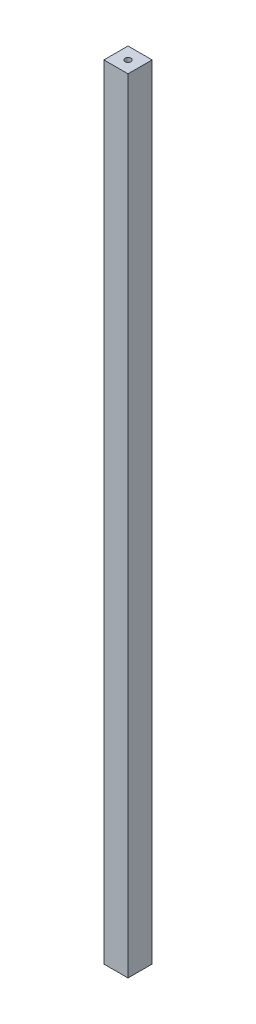
ISO-10303-21;
HEADER;
FILE_DESCRIPTION(('STEP AP214'),'2;1');
FILE_NAME('part.step','',(''),(''),'','','');
FILE_SCHEMA(('AUTOMOTIVE_DESIGN { 1 0 10303 214 1 1 1 1 }'));
ENDSEC;
DATA;
#1=APPLICATION_CONTEXT('core data for automotive mechanical design processes');
#2=APPLICATION_PROTOCOL_DEFINITION('international standard','automotive_design',2000,#1);
#3=PRODUCT_CONTEXT('',#1,'mechanical');
#4=PRODUCT('Part','Part','',(#3));
#5=PRODUCT_RELATED_PRODUCT_CATEGORY('part','',(#4));
#6=PRODUCT_DEFINITION_FORMATION('','',#4);
#7=PRODUCT_DEFINITION_CONTEXT('part definition',#1,'design');
#8=PRODUCT_DEFINITION('design','',#6,#7);
#9=PRODUCT_DEFINITION_SHAPE('','',#8);
#10=(LENGTH_UNIT() NAMED_UNIT(*) SI_UNIT(.MILLI.,.METRE.));
#11=(NAMED_UNIT(*) PLANE_ANGLE_UNIT() SI_UNIT($,.RADIAN.));
#12=(NAMED_UNIT(*) SI_UNIT($,.STERADIAN.) SOLID_ANGLE_UNIT());
#13=UNCERTAINTY_MEASURE_WITH_UNIT(LENGTH_MEASURE(1.E-05),#10,'distance_accuracy_value','');
#14=(GEOMETRIC_REPRESENTATION_CONTEXT(3) GLOBAL_UNCERTAINTY_ASSIGNED_CONTEXT((#13)) GLOBAL_UNIT_ASSIGNED_CONTEXT((#10,
#11,#12)) REPRESENTATION_CONTEXT('',''));
#15=CARTESIAN_POINT('',(0.,0.,0.));
#16=DIRECTION('',(0.,0.,1.));
#17=DIRECTION('',(1.,0.,0.));
#18=AXIS2_PLACEMENT_3D('',#15,#16,#17);
#19=CARTESIAN_POINT('',(-10.,650.,10.));
#20=DIRECTION('',(1.,0.,0.));
#21=DIRECTION('',(0.,0.,-1.));
#22=AXIS2_PLACEMENT_3D('',#19,#20,#21);
#23=PLANE('',#22);
#24=DIRECTION('',(0.,0.,1.));
#25=VECTOR('',#24,1.);
#26=CARTESIAN_POINT('',(-10.,0.,10.));
#27=LINE('',#26,#25);
#28=CARTESIAN_POINT('',(-10.,0.,-10.));
#29=VERTEX_POINT('',#28);
#30=CARTESIAN_POINT('',(-10.,0.,10.));
#31=VERTEX_POINT('',#30);
#32=EDGE_CURVE('E98',#29,#31,#27,.T.);
#33=ORIENTED_EDGE('',*,*,#32,.T.);
#34=DIRECTION('',(0.,-1.,0.));
#35=VECTOR('',#34,1.);
#36=CARTESIAN_POINT('',(-10.,650.,10.));
#37=LINE('',#36,#35);
#38=CARTESIAN_POINT('',(-10.,650.,10.));
#39=VERTEX_POINT('',#38);
#40=EDGE_CURVE('E11',#39,#31,#37,.T.);
#41=ORIENTED_EDGE('',*,*,#40,.F.);
#42=DIRECTION('',(0.,0.,1.));
#43=VECTOR('',#42,1.);
#44=CARTESIAN_POINT('',(-10.,650.,10.));
#45=LINE('',#44,#43);
#46=CARTESIAN_POINT('',(-10.,650.,-10.));
#47=VERTEX_POINT('',#46);
#48=EDGE_CURVE('E85',#47,#39,#45,.T.);
#49=ORIENTED_EDGE('',*,*,#48,.F.);
#50=DIRECTION('',(0.,-1.,0.));
#51=VECTOR('',#50,1.);
#52=CARTESIAN_POINT('',(-10.,650.,-10.));
#53=LINE('',#52,#51);
#54=EDGE_CURVE('E94',#47,#29,#53,.T.);
#55=ORIENTED_EDGE('',*,*,#54,.T.);
#56=EDGE_LOOP('',(#33,#41,#49,#55));
#57=FACE_BOUND('',#56,.T.);
#58=ADVANCED_FACE('F33',(#57),#23,.F.);
#59=CARTESIAN_POINT('',(10.,650.,10.));
#60=DIRECTION('',(0.,0.,-1.));
#61=DIRECTION('',(-1.,0.,0.));
#62=AXIS2_PLACEMENT_3D('',#59,#60,#61);
#63=PLANE('',#62);
#64=DIRECTION('',(1.,0.,0.));
#65=VECTOR('',#64,1.);
#66=CARTESIAN_POINT('',(10.,0.,10.));
#67=LINE('',#66,#65);
#68=CARTESIAN_POINT('',(10.,0.,10.));
#69=VERTEX_POINT('',#68);
#70=EDGE_CURVE('E89',#31,#69,#67,.T.);
#71=ORIENTED_EDGE('',*,*,#70,.T.);
#72=DIRECTION('',(0.,-1.,0.));
#73=VECTOR('',#72,1.);
#74=CARTESIAN_POINT('',(10.,650.,10.));
#75=LINE('',#74,#73);
#76=CARTESIAN_POINT('',(10.,650.,10.));
#77=VERTEX_POINT('',#76);
#78=EDGE_CURVE('E42',#77,#69,#75,.T.);
#79=ORIENTED_EDGE('',*,*,#78,.F.);
#80=DIRECTION('',(1.,0.,0.));
#81=VECTOR('',#80,1.);
#82=CARTESIAN_POINT('',(10.,650.,10.));
#83=LINE('',#82,#81);
#84=EDGE_CURVE('E80',#39,#77,#83,.T.);
#85=ORIENTED_EDGE('',*,*,#84,.F.);
#86=ORIENTED_EDGE('',*,*,#40,.T.);
#87=EDGE_LOOP('',(#71,#79,#85,#86));
#88=FACE_BOUND('',#87,.T.);
#89=ADVANCED_FACE('F88',(#88),#63,.F.);
#90=CARTESIAN_POINT('',(10.,650.,10.));
#91=DIRECTION('',(-1.,0.,0.));
#92=DIRECTION('',(0.,0.,1.));
#93=AXIS2_PLACEMENT_3D('',#90,#91,#92);
#94=PLANE('',#93);
#95=DIRECTION('',(0.,0.,-1.));
#96=VECTOR('',#95,1.);
#97=CARTESIAN_POINT('',(10.,0.,10.));
#98=LINE('',#97,#96);
#99=CARTESIAN_POINT('',(10.,0.,-10.));
#100=VERTEX_POINT('',#99);
#101=EDGE_CURVE('E67',#69,#100,#98,.T.);
#102=ORIENTED_EDGE('',*,*,#101,.T.);
#103=DIRECTION('',(0.,-1.,0.));
#104=VECTOR('',#103,1.);
#105=CARTESIAN_POINT('',(10.,650.,-10.));
#106=LINE('',#105,#104);
#107=CARTESIAN_POINT('',(10.,650.,-10.));
#108=VERTEX_POINT('',#107);
#109=EDGE_CURVE('E90',#108,#100,#106,.T.);
#110=ORIENTED_EDGE('',*,*,#109,.F.);
#111=DIRECTION('',(0.,0.,-1.));
#112=VECTOR('',#111,1.);
#113=CARTESIAN_POINT('',(10.,650.,10.));
#114=LINE('',#113,#112);
#115=EDGE_CURVE('E83',#77,#108,#114,.T.);
#116=ORIENTED_EDGE('',*,*,#115,.F.);
#117=ORIENTED_EDGE('',*,*,#78,.T.);
#118=EDGE_LOOP('',(#102,#110,#116,#117));
#119=FACE_BOUND('',#118,.T.);
#120=ADVANCED_FACE('F92',(#119),#94,.F.);
#121=CARTESIAN_POINT('',(10.,650.,-10.));
#122=DIRECTION('',(0.,0.,1.));
#123=DIRECTION('',(1.,0.,0.));
#124=AXIS2_PLACEMENT_3D('',#121,#122,#123);
#125=PLANE('',#124);
#126=DIRECTION('',(-1.,0.,0.));
#127=VECTOR('',#126,1.);
#128=CARTESIAN_POINT('',(10.,0.,-10.));
#129=LINE('',#128,#127);
#130=EDGE_CURVE('E73',#100,#29,#129,.T.);
#131=ORIENTED_EDGE('',*,*,#130,.T.);
#132=ORIENTED_EDGE('',*,*,#54,.F.);
#133=DIRECTION('',(-1.,0.,0.));
#134=VECTOR('',#133,1.);
#135=CARTESIAN_POINT('',(10.,650.,-10.));
#136=LINE('',#135,#134);
#137=EDGE_CURVE('E50',#108,#47,#136,.T.);
#138=ORIENTED_EDGE('',*,*,#137,.F.);
#139=ORIENTED_EDGE('',*,*,#109,.T.);
#140=EDGE_LOOP('',(#131,#132,#138,#139));
#141=FACE_BOUND('',#140,.T.);
#142=ADVANCED_FACE('F105',(#141),#125,.F.);
#143=CARTESIAN_POINT('',(0.,650.,0.));
#144=DIRECTION('',(0.,1.,0.));
#145=DIRECTION('',(0.,0.,1.));
#146=AXIS2_PLACEMENT_3D('',#143,#144,#145);
#147=PLANE('',#146);
#148=CARTESIAN_POINT('',(0.,650.,0.));
#149=DIRECTION('',(0.,1.,0.));
#150=DIRECTION('',(0.,0.,1.));
#151=AXIS2_PLACEMENT_3D('',#148,#149,#150);
#152=CIRCLE('',#151,2.5);
#153=CARTESIAN_POINT('',(0.,650.,2.5));
#154=VERTEX_POINT('',#153);
#155=EDGE_CURVE('E111',#154,#154,#152,.T.);
#156=ORIENTED_EDGE('',*,*,#155,.F.);
#157=EDGE_LOOP('',(#156));
#158=FACE_BOUND('',#157,.T.);
#159=ORIENTED_EDGE('',*,*,#48,.T.);
#160=ORIENTED_EDGE('',*,*,#84,.T.);
#161=ORIENTED_EDGE('',*,*,#115,.T.);
#162=ORIENTED_EDGE('',*,*,#137,.T.);
#163=EDGE_LOOP('',(#159,#160,#161,#162));
#164=FACE_BOUND('',#163,.T.);
#165=ADVANCED_FACE('F81',(#158,#164),#147,.T.);
#166=CARTESIAN_POINT('',(0.,0.,0.));
#167=DIRECTION('',(0.,1.,0.));
#168=DIRECTION('',(0.,0.,1.));
#169=AXIS2_PLACEMENT_3D('',#166,#167,#168);
#170=PLANE('',#169);
#171=CARTESIAN_POINT('',(0.,0.,0.));
#172=DIRECTION('',(0.,1.,0.));
#173=DIRECTION('',(0.,0.,1.));
#174=AXIS2_PLACEMENT_3D('',#171,#172,#173);
#175=CIRCLE('',#174,2.5);
#176=CARTESIAN_POINT('',(0.,0.,2.5));
#177=VERTEX_POINT('',#176);
#178=EDGE_CURVE('E36',#177,#177,#175,.T.);
#179=ORIENTED_EDGE('',*,*,#178,.T.);
#180=EDGE_LOOP('',(#179));
#181=FACE_BOUND('',#180,.T.);
#182=ORIENTED_EDGE('',*,*,#32,.F.);
#183=ORIENTED_EDGE('',*,*,#130,.F.);
#184=ORIENTED_EDGE('',*,*,#101,.F.);
#185=ORIENTED_EDGE('',*,*,#70,.F.);
#186=EDGE_LOOP('',(#182,#183,#184,#185));
#187=FACE_BOUND('',#186,.T.);
#188=ADVANCED_FACE('F108',(#181,#187),#170,.F.);
#189=CARTESIAN_POINT('',(0.,-150.,0.));
#190=DIRECTION('',(0.,1.,0.));
#191=DIRECTION('',(0.,0.,1.));
#192=AXIS2_PLACEMENT_3D('',#189,#190,#191);
#193=CYLINDRICAL_SURFACE('',#192,2.5);
#194=ORIENTED_EDGE('',*,*,#155,.T.);
#195=EDGE_LOOP('',(#194));
#196=FACE_BOUND('',#195,.T.);
#197=ORIENTED_EDGE('',*,*,#178,.F.);
#198=EDGE_LOOP('',(#197));
#199=FACE_BOUND('',#198,.T.);
#200=ADVANCED_FACE('F119',(#196,#199),#193,.F.);
#201=CLOSED_SHELL('',(#58,#89,#120,#142,#165,#188,#200));
#202=MANIFOLD_SOLID_BREP('B2',#201);
#203=ADVANCED_BREP_SHAPE_REPRESENTATION('',(#18,#202),#14);
#204=SHAPE_DEFINITION_REPRESENTATION(#9,#203);
ENDSEC;
END-ISO-10303-21;
